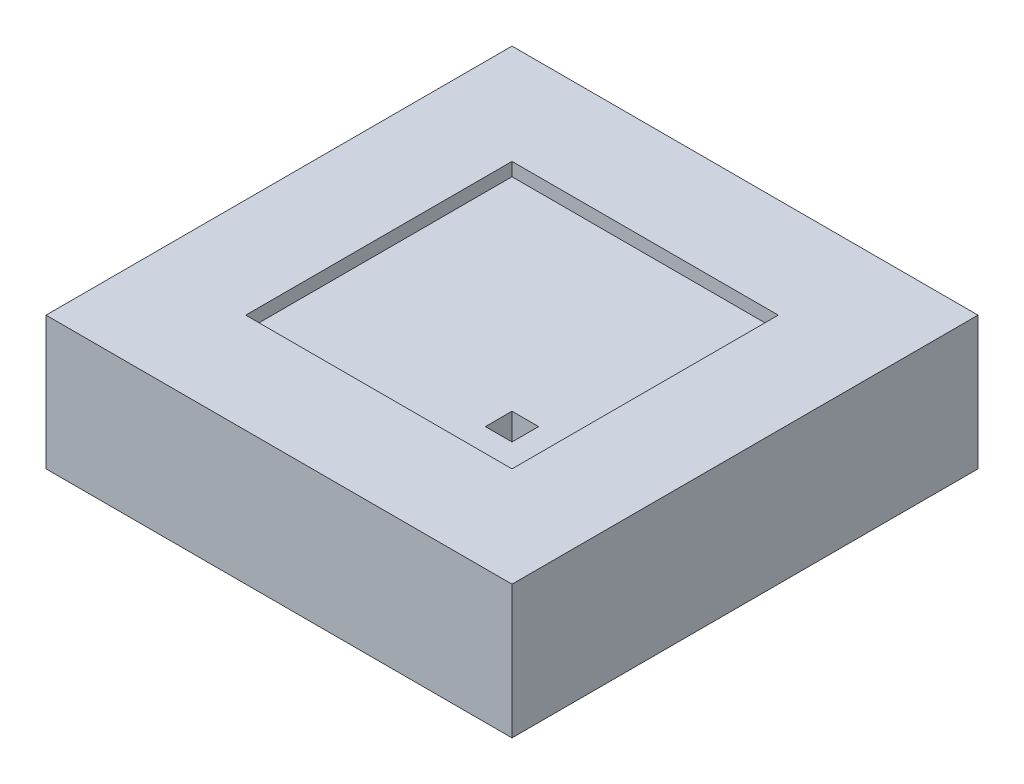
ISO-10303-21;
HEADER;
FILE_DESCRIPTION(('STEP AP214'),'2;1');
FILE_NAME('part.step','',(''),(''),'','','');
FILE_SCHEMA(('AUTOMOTIVE_DESIGN { 1 0 10303 214 1 1 1 1 }'));
ENDSEC;
DATA;
#1=APPLICATION_CONTEXT('core data for automotive mechanical design processes');
#2=APPLICATION_PROTOCOL_DEFINITION('international standard','automotive_design',2000,#1);
#3=PRODUCT_CONTEXT('',#1,'mechanical');
#4=PRODUCT('Part','Part','',(#3));
#5=PRODUCT_RELATED_PRODUCT_CATEGORY('part','',(#4));
#6=PRODUCT_DEFINITION_FORMATION('','',#4);
#7=PRODUCT_DEFINITION_CONTEXT('part definition',#1,'design');
#8=PRODUCT_DEFINITION('design','',#6,#7);
#9=PRODUCT_DEFINITION_SHAPE('','',#8);
#10=(LENGTH_UNIT() NAMED_UNIT(*) SI_UNIT(.MILLI.,.METRE.));
#11=(NAMED_UNIT(*) PLANE_ANGLE_UNIT() SI_UNIT($,.RADIAN.));
#12=(NAMED_UNIT(*) SI_UNIT($,.STERADIAN.) SOLID_ANGLE_UNIT());
#13=UNCERTAINTY_MEASURE_WITH_UNIT(LENGTH_MEASURE(1.E-05),#10,'distance_accuracy_value','');
#14=(GEOMETRIC_REPRESENTATION_CONTEXT(3) GLOBAL_UNCERTAINTY_ASSIGNED_CONTEXT((#13)) GLOBAL_UNIT_ASSIGNED_CONTEXT((#10,
#11,#12)) REPRESENTATION_CONTEXT('',''));
#15=CARTESIAN_POINT('',(0.,0.,0.));
#16=DIRECTION('',(0.,0.,1.));
#17=DIRECTION('',(1.,0.,0.));
#18=AXIS2_PLACEMENT_3D('',#15,#16,#17);
#19=CARTESIAN_POINT('',(0.,20.,0.));
#20=DIRECTION('',(1.,0.,0.));
#21=DIRECTION('',(0.,0.,-1.));
#22=AXIS2_PLACEMENT_3D('',#19,#20,#21);
#23=PLANE('',#22);
#24=DIRECTION('',(0.,0.,1.));
#25=VECTOR('',#24,1.);
#26=CARTESIAN_POINT('',(0.,0.,0.));
#27=LINE('',#26,#25);
#28=CARTESIAN_POINT('',(0.,0.,-70.));
#29=VERTEX_POINT('',#28);
#30=CARTESIAN_POINT('',(0.,0.,0.));
#31=VERTEX_POINT('',#30);
#32=EDGE_CURVE('E195',#29,#31,#27,.T.);
#33=ORIENTED_EDGE('',*,*,#32,.T.);
#34=DIRECTION('',(0.,-1.,0.));
#35=VECTOR('',#34,1.);
#36=CARTESIAN_POINT('',(0.,20.,0.));
#37=LINE('',#36,#35);
#38=CARTESIAN_POINT('',(0.,20.,0.));
#39=VERTEX_POINT('',#38);
#40=EDGE_CURVE('E12',#39,#31,#37,.T.);
#41=ORIENTED_EDGE('',*,*,#40,.F.);
#42=DIRECTION('',(0.,0.,1.));
#43=VECTOR('',#42,1.);
#44=CARTESIAN_POINT('',(0.,20.,0.));
#45=LINE('',#44,#43);
#46=CARTESIAN_POINT('',(0.,20.,-70.));
#47=VERTEX_POINT('',#46);
#48=EDGE_CURVE('E202',#47,#39,#45,.T.);
#49=ORIENTED_EDGE('',*,*,#48,.F.);
#50=DIRECTION('',(0.,-1.,0.));
#51=VECTOR('',#50,1.);
#52=CARTESIAN_POINT('',(0.,20.,-70.));
#53=LINE('',#52,#51);
#54=EDGE_CURVE('E219',#47,#29,#53,.T.);
#55=ORIENTED_EDGE('',*,*,#54,.T.);
#56=EDGE_LOOP('',(#33,#41,#49,#55));
#57=FACE_BOUND('',#56,.T.);
#58=ADVANCED_FACE('F37',(#57),#23,.F.);
#59=CARTESIAN_POINT('',(0.,20.,0.));
#60=DIRECTION('',(0.,0.,-1.));
#61=DIRECTION('',(-1.,0.,0.));
#62=AXIS2_PLACEMENT_3D('',#59,#60,#61);
#63=PLANE('',#62);
#64=DIRECTION('',(1.,0.,0.));
#65=VECTOR('',#64,1.);
#66=CARTESIAN_POINT('',(0.,0.,0.));
#67=LINE('',#66,#65);
#68=CARTESIAN_POINT('',(70.,0.,0.));
#69=VERTEX_POINT('',#68);
#70=EDGE_CURVE('E222',#31,#69,#67,.T.);
#71=ORIENTED_EDGE('',*,*,#70,.T.);
#72=DIRECTION('',(0.,-1.,0.));
#73=VECTOR('',#72,1.);
#74=CARTESIAN_POINT('',(70.,20.,0.));
#75=LINE('',#74,#73);
#76=CARTESIAN_POINT('',(70.,20.,0.));
#77=VERTEX_POINT('',#76);
#78=EDGE_CURVE('E44',#77,#69,#75,.T.);
#79=ORIENTED_EDGE('',*,*,#78,.F.);
#80=DIRECTION('',(1.,0.,0.));
#81=VECTOR('',#80,1.);
#82=CARTESIAN_POINT('',(0.,20.,0.));
#83=LINE('',#82,#81);
#84=EDGE_CURVE('E207',#39,#77,#83,.T.);
#85=ORIENTED_EDGE('',*,*,#84,.F.);
#86=ORIENTED_EDGE('',*,*,#40,.T.);
#87=EDGE_LOOP('',(#71,#79,#85,#86));
#88=FACE_BOUND('',#87,.T.);
#89=ADVANCED_FACE('F284',(#88),#63,.F.);
#90=CARTESIAN_POINT('',(70.,20.,0.));
#91=DIRECTION('',(-1.,0.,0.));
#92=DIRECTION('',(0.,0.,1.));
#93=AXIS2_PLACEMENT_3D('',#90,#91,#92);
#94=PLANE('',#93);
#95=DIRECTION('',(0.,0.,-1.));
#96=VECTOR('',#95,1.);
#97=CARTESIAN_POINT('',(70.,0.,0.));
#98=LINE('',#97,#96);
#99=CARTESIAN_POINT('',(70.,0.,-70.));
#100=VERTEX_POINT('',#99);
#101=EDGE_CURVE('E224',#69,#100,#98,.T.);
#102=ORIENTED_EDGE('',*,*,#101,.T.);
#103=DIRECTION('',(0.,-1.,0.));
#104=VECTOR('',#103,1.);
#105=CARTESIAN_POINT('',(70.,20.,-70.));
#106=LINE('',#105,#104);
#107=CARTESIAN_POINT('',(70.,20.,-70.));
#108=VERTEX_POINT('',#107);
#109=EDGE_CURVE('E229',#108,#100,#106,.T.);
#110=ORIENTED_EDGE('',*,*,#109,.F.);
#111=DIRECTION('',(0.,0.,-1.));
#112=VECTOR('',#111,1.);
#113=CARTESIAN_POINT('',(70.,20.,0.));
#114=LINE('',#113,#112);
#115=EDGE_CURVE('E212',#77,#108,#114,.T.);
#116=ORIENTED_EDGE('',*,*,#115,.F.);
#117=ORIENTED_EDGE('',*,*,#78,.T.);
#118=EDGE_LOOP('',(#102,#110,#116,#117));
#119=FACE_BOUND('',#118,.T.);
#120=ADVANCED_FACE('F236',(#119),#94,.F.);
#121=CARTESIAN_POINT('',(0.,20.,-70.));
#122=DIRECTION('',(0.,0.,1.));
#123=DIRECTION('',(1.,0.,0.));
#124=AXIS2_PLACEMENT_3D('',#121,#122,#123);
#125=PLANE('',#124);
#126=DIRECTION('',(-1.,0.,0.));
#127=VECTOR('',#126,1.);
#128=CARTESIAN_POINT('',(0.,0.,-70.));
#129=LINE('',#128,#127);
#130=EDGE_CURVE('E208',#100,#29,#129,.T.);
#131=ORIENTED_EDGE('',*,*,#130,.T.);
#132=ORIENTED_EDGE('',*,*,#54,.F.);
#133=DIRECTION('',(-1.,0.,0.));
#134=VECTOR('',#133,1.);
#135=CARTESIAN_POINT('',(0.,20.,-70.));
#136=LINE('',#135,#134);
#137=EDGE_CURVE('E215',#108,#47,#136,.T.);
#138=ORIENTED_EDGE('',*,*,#137,.F.);
#139=ORIENTED_EDGE('',*,*,#109,.T.);
#140=EDGE_LOOP('',(#131,#132,#138,#139));
#141=FACE_BOUND('',#140,.T.);
#142=ADVANCED_FACE('F245',(#141),#125,.F.);
#143=CARTESIAN_POINT('',(0.,20.,0.));
#144=DIRECTION('',(0.,-1.,0.));
#145=DIRECTION('',(0.,0.,-1.));
#146=AXIS2_PLACEMENT_3D('',#143,#144,#145);
#147=PLANE('',#146);
#148=DIRECTION('',(0.,0.,1.));
#149=VECTOR('',#148,1.);
#150=CARTESIAN_POINT('',(15.,20.,-55.));
#151=LINE('',#150,#149);
#152=CARTESIAN_POINT('',(15.,20.,-55.));
#153=VERTEX_POINT('',#152);
#154=CARTESIAN_POINT('',(15.,20.,-15.));
#155=VERTEX_POINT('',#154);
#156=EDGE_CURVE('E178',#153,#155,#151,.T.);
#157=ORIENTED_EDGE('',*,*,#156,.F.);
#158=DIRECTION('',(-1.,0.,0.));
#159=VECTOR('',#158,1.);
#160=CARTESIAN_POINT('',(55.,20.,-55.));
#161=LINE('',#160,#159);
#162=CARTESIAN_POINT('',(55.,20.,-55.));
#163=VERTEX_POINT('',#162);
#164=EDGE_CURVE('E160',#163,#153,#161,.T.);
#165=ORIENTED_EDGE('',*,*,#164,.F.);
#166=DIRECTION('',(0.,0.,-1.));
#167=VECTOR('',#166,1.);
#168=CARTESIAN_POINT('',(55.,20.,-15.));
#169=LINE('',#168,#167);
#170=CARTESIAN_POINT('',(55.,20.,-15.));
#171=VERTEX_POINT('',#170);
#172=EDGE_CURVE('E165',#171,#163,#169,.T.);
#173=ORIENTED_EDGE('',*,*,#172,.F.);
#174=DIRECTION('',(1.,0.,0.));
#175=VECTOR('',#174,1.);
#176=CARTESIAN_POINT('',(15.,20.,-15.));
#177=LINE('',#176,#175);
#178=EDGE_CURVE('E191',#155,#171,#177,.T.);
#179=ORIENTED_EDGE('',*,*,#178,.F.);
#180=EDGE_LOOP('',(#157,#165,#173,#179));
#181=FACE_BOUND('',#180,.T.);
#182=ORIENTED_EDGE('',*,*,#48,.T.);
#183=ORIENTED_EDGE('',*,*,#84,.T.);
#184=ORIENTED_EDGE('',*,*,#115,.T.);
#185=ORIENTED_EDGE('',*,*,#137,.T.);
#186=EDGE_LOOP('',(#182,#183,#184,#185));
#187=FACE_BOUND('',#186,.T.);
#188=ADVANCED_FACE('F251',(#181,#187),#147,.F.);
#189=CARTESIAN_POINT('',(0.,0.,0.));
#190=DIRECTION('',(0.,-1.,0.));
#191=DIRECTION('',(0.,0.,-1.));
#192=AXIS2_PLACEMENT_3D('',#189,#190,#191);
#193=PLANE('',#192);
#194=DIRECTION('',(0.,0.,-1.));
#195=VECTOR('',#194,1.);
#196=CARTESIAN_POINT('',(45.5,0.,0.));
#197=LINE('',#196,#195);
#198=CARTESIAN_POINT('',(45.5,0.,-20.5));
#199=VERTEX_POINT('',#198);
#200=CARTESIAN_POINT('',(45.5,0.,-24.5));
#201=VERTEX_POINT('',#200);
#202=EDGE_CURVE('E158',#199,#201,#197,.T.);
#203=ORIENTED_EDGE('',*,*,#202,.F.);
#204=DIRECTION('',(-1.,0.,0.));
#205=VECTOR('',#204,1.);
#206=CARTESIAN_POINT('',(0.,0.,-20.5));
#207=LINE('',#206,#205);
#208=CARTESIAN_POINT('',(49.5,0.,-20.5));
#209=VERTEX_POINT('',#208);
#210=EDGE_CURVE('E151',#209,#199,#207,.T.);
#211=ORIENTED_EDGE('',*,*,#210,.F.);
#212=DIRECTION('',(0.,0.,1.));
#213=VECTOR('',#212,1.);
#214=CARTESIAN_POINT('',(49.5,0.,0.));
#215=LINE('',#214,#213);
#216=CARTESIAN_POINT('',(49.5,0.,-24.5));
#217=VERTEX_POINT('',#216);
#218=EDGE_CURVE('E131',#217,#209,#215,.T.);
#219=ORIENTED_EDGE('',*,*,#218,.F.);
#220=DIRECTION('',(1.,0.,0.));
#221=VECTOR('',#220,1.);
#222=CARTESIAN_POINT('',(0.,0.,-24.5));
#223=LINE('',#222,#221);
#224=EDGE_CURVE('E156',#201,#217,#223,.T.);
#225=ORIENTED_EDGE('',*,*,#224,.F.);
#226=EDGE_LOOP('',(#203,#211,#219,#225));
#227=FACE_BOUND('',#226,.T.);
#228=ORIENTED_EDGE('',*,*,#32,.F.);
#229=ORIENTED_EDGE('',*,*,#130,.F.);
#230=ORIENTED_EDGE('',*,*,#101,.F.);
#231=ORIENTED_EDGE('',*,*,#70,.F.);
#232=EDGE_LOOP('',(#228,#229,#230,#231));
#233=FACE_BOUND('',#232,.T.);
#234=ADVANCED_FACE('F242',(#227,#233),#193,.T.);
#235=CARTESIAN_POINT('',(55.,18.,-55.));
#236=DIRECTION('',(0.,0.,-1.));
#237=DIRECTION('',(-1.,0.,0.));
#238=AXIS2_PLACEMENT_3D('',#235,#236,#237);
#239=PLANE('',#238);
#240=ORIENTED_EDGE('',*,*,#164,.T.);
#241=DIRECTION('',(0.,1.,0.));
#242=VECTOR('',#241,1.);
#243=CARTESIAN_POINT('',(15.,18.,-55.));
#244=LINE('',#243,#242);
#245=CARTESIAN_POINT('',(15.,18.,-55.));
#246=VERTEX_POINT('',#245);
#247=EDGE_CURVE('E174',#246,#153,#244,.T.);
#248=ORIENTED_EDGE('',*,*,#247,.F.);
#249=DIRECTION('',(-1.,0.,0.));
#250=VECTOR('',#249,1.);
#251=CARTESIAN_POINT('',(55.,18.,-55.));
#252=LINE('',#251,#250);
#253=CARTESIAN_POINT('',(55.,18.,-55.));
#254=VERTEX_POINT('',#253);
#255=EDGE_CURVE('E161',#254,#246,#252,.T.);
#256=ORIENTED_EDGE('',*,*,#255,.F.);
#257=DIRECTION('',(0.,1.,0.));
#258=VECTOR('',#257,1.);
#259=CARTESIAN_POINT('',(55.,18.,-55.));
#260=LINE('',#259,#258);
#261=EDGE_CURVE('E193',#254,#163,#260,.T.);
#262=ORIENTED_EDGE('',*,*,#261,.T.);
#263=EDGE_LOOP('',(#240,#248,#256,#262));
#264=FACE_BOUND('',#263,.T.);
#265=ADVANCED_FACE('F271',(#264),#239,.F.);
#266=CARTESIAN_POINT('',(55.,18.,-15.));
#267=DIRECTION('',(1.,0.,0.));
#268=DIRECTION('',(0.,0.,-1.));
#269=AXIS2_PLACEMENT_3D('',#266,#267,#268);
#270=PLANE('',#269);
#271=ORIENTED_EDGE('',*,*,#172,.T.);
#272=ORIENTED_EDGE('',*,*,#261,.F.);
#273=DIRECTION('',(0.,0.,-1.));
#274=VECTOR('',#273,1.);
#275=CARTESIAN_POINT('',(55.,18.,-15.));
#276=LINE('',#275,#274);
#277=CARTESIAN_POINT('',(55.,18.,-15.));
#278=VERTEX_POINT('',#277);
#279=EDGE_CURVE('E171',#278,#254,#276,.T.);
#280=ORIENTED_EDGE('',*,*,#279,.F.);
#281=DIRECTION('',(0.,1.,0.));
#282=VECTOR('',#281,1.);
#283=CARTESIAN_POINT('',(55.,18.,-15.));
#284=LINE('',#283,#282);
#285=EDGE_CURVE('E196',#278,#171,#284,.T.);
#286=ORIENTED_EDGE('',*,*,#285,.T.);
#287=EDGE_LOOP('',(#271,#272,#280,#286));
#288=FACE_BOUND('',#287,.T.);
#289=ADVANCED_FACE('F273',(#288),#270,.F.);
#290=CARTESIAN_POINT('',(15.,18.,-15.));
#291=DIRECTION('',(0.,0.,1.));
#292=DIRECTION('',(1.,0.,0.));
#293=AXIS2_PLACEMENT_3D('',#290,#291,#292);
#294=PLANE('',#293);
#295=ORIENTED_EDGE('',*,*,#178,.T.);
#296=ORIENTED_EDGE('',*,*,#285,.F.);
#297=DIRECTION('',(1.,0.,0.));
#298=VECTOR('',#297,1.);
#299=CARTESIAN_POINT('',(15.,18.,-15.));
#300=LINE('',#299,#298);
#301=CARTESIAN_POINT('',(15.,18.,-15.));
#302=VERTEX_POINT('',#301);
#303=EDGE_CURVE('E168',#302,#278,#300,.T.);
#304=ORIENTED_EDGE('',*,*,#303,.F.);
#305=DIRECTION('',(0.,1.,0.));
#306=VECTOR('',#305,1.);
#307=CARTESIAN_POINT('',(15.,18.,-15.));
#308=LINE('',#307,#306);
#309=EDGE_CURVE('E198',#302,#155,#308,.T.);
#310=ORIENTED_EDGE('',*,*,#309,.T.);
#311=EDGE_LOOP('',(#295,#296,#304,#310));
#312=FACE_BOUND('',#311,.T.);
#313=ADVANCED_FACE('F267',(#312),#294,.F.);
#314=CARTESIAN_POINT('',(15.,18.,-55.));
#315=DIRECTION('',(-1.,0.,0.));
#316=DIRECTION('',(0.,0.,1.));
#317=AXIS2_PLACEMENT_3D('',#314,#315,#316);
#318=PLANE('',#317);
#319=ORIENTED_EDGE('',*,*,#156,.T.);
#320=ORIENTED_EDGE('',*,*,#309,.F.);
#321=DIRECTION('',(0.,0.,1.));
#322=VECTOR('',#321,1.);
#323=CARTESIAN_POINT('',(15.,18.,-55.));
#324=LINE('',#323,#322);
#325=EDGE_CURVE('E164',#246,#302,#324,.T.);
#326=ORIENTED_EDGE('',*,*,#325,.F.);
#327=ORIENTED_EDGE('',*,*,#247,.T.);
#328=EDGE_LOOP('',(#319,#320,#326,#327));
#329=FACE_BOUND('',#328,.T.);
#330=ADVANCED_FACE('F260',(#329),#318,.F.);
#331=CARTESIAN_POINT('',(0.,18.,0.));
#332=DIRECTION('',(0.,1.,0.));
#333=DIRECTION('',(0.,0.,1.));
#334=AXIS2_PLACEMENT_3D('',#331,#332,#333);
#335=PLANE('',#334);
#336=DIRECTION('',(0.,0.,1.));
#337=VECTOR('',#336,1.);
#338=CARTESIAN_POINT('',(45.5,18.,-20.5));
#339=LINE('',#338,#337);
#340=CARTESIAN_POINT('',(45.5,18.,-24.5));
#341=VERTEX_POINT('',#340);
#342=CARTESIAN_POINT('',(45.5,18.,-20.5));
#343=VERTEX_POINT('',#342);
#344=EDGE_CURVE('E59',#341,#343,#339,.T.);
#345=ORIENTED_EDGE('',*,*,#344,.F.);
#346=DIRECTION('',(-1.,0.,0.));
#347=VECTOR('',#346,1.);
#348=CARTESIAN_POINT('',(45.5,18.,-24.5));
#349=LINE('',#348,#347);
#350=CARTESIAN_POINT('',(49.5,18.,-24.5));
#351=VERTEX_POINT('',#350);
#352=EDGE_CURVE('E144',#351,#341,#349,.T.);
#353=ORIENTED_EDGE('',*,*,#352,.F.);
#354=DIRECTION('',(0.,0.,-1.));
#355=VECTOR('',#354,1.);
#356=CARTESIAN_POINT('',(49.5,18.,-20.5));
#357=LINE('',#356,#355);
#358=CARTESIAN_POINT('',(49.5,18.,-20.5));
#359=VERTEX_POINT('',#358);
#360=EDGE_CURVE('E128',#359,#351,#357,.T.);
#361=ORIENTED_EDGE('',*,*,#360,.F.);
#362=DIRECTION('',(1.,0.,0.));
#363=VECTOR('',#362,1.);
#364=CARTESIAN_POINT('',(45.5,18.,-20.5));
#365=LINE('',#364,#363);
#366=EDGE_CURVE('E137',#343,#359,#365,.T.);
#367=ORIENTED_EDGE('',*,*,#366,.F.);
#368=EDGE_LOOP('',(#345,#353,#361,#367));
#369=FACE_BOUND('',#368,.T.);
#370=ORIENTED_EDGE('',*,*,#255,.T.);
#371=ORIENTED_EDGE('',*,*,#325,.T.);
#372=ORIENTED_EDGE('',*,*,#303,.T.);
#373=ORIENTED_EDGE('',*,*,#279,.T.);
#374=EDGE_LOOP('',(#370,#371,#372,#373));
#375=FACE_BOUND('',#374,.T.);
#376=ADVANCED_FACE('F141',(#369,#375),#335,.T.);
#377=CARTESIAN_POINT('',(45.5,-37.,-20.5));
#378=DIRECTION('',(-1.,0.,0.));
#379=DIRECTION('',(0.,0.,1.));
#380=AXIS2_PLACEMENT_3D('',#377,#378,#379);
#381=PLANE('',#380);
#382=ORIENTED_EDGE('',*,*,#202,.T.);
#383=DIRECTION('',(0.,1.,0.));
#384=VECTOR('',#383,1.);
#385=CARTESIAN_POINT('',(45.5,-37.,-24.5));
#386=LINE('',#385,#384);
#387=EDGE_CURVE('E149',#201,#341,#386,.T.);
#388=ORIENTED_EDGE('',*,*,#387,.T.);
#389=ORIENTED_EDGE('',*,*,#344,.T.);
#390=DIRECTION('',(0.,1.,0.));
#391=VECTOR('',#390,1.);
#392=CARTESIAN_POINT('',(45.5,-37.,-20.5));
#393=LINE('',#392,#391);
#394=EDGE_CURVE('E134',#199,#343,#393,.T.);
#395=ORIENTED_EDGE('',*,*,#394,.F.);
#396=EDGE_LOOP('',(#382,#388,#389,#395));
#397=FACE_BOUND('',#396,.T.);
#398=ADVANCED_FACE('F304',(#397),#381,.F.);
#399=CARTESIAN_POINT('',(45.5,-37.,-24.5));
#400=DIRECTION('',(0.,0.,-1.));
#401=DIRECTION('',(-1.,0.,0.));
#402=AXIS2_PLACEMENT_3D('',#399,#400,#401);
#403=PLANE('',#402);
#404=ORIENTED_EDGE('',*,*,#224,.T.);
#405=DIRECTION('',(0.,1.,0.));
#406=VECTOR('',#405,1.);
#407=CARTESIAN_POINT('',(49.5,-37.,-24.5));
#408=LINE('',#407,#406);
#409=EDGE_CURVE('E133',#217,#351,#408,.T.);
#410=ORIENTED_EDGE('',*,*,#409,.T.);
#411=ORIENTED_EDGE('',*,*,#352,.T.);
#412=ORIENTED_EDGE('',*,*,#387,.F.);
#413=EDGE_LOOP('',(#404,#410,#411,#412));
#414=FACE_BOUND('',#413,.T.);
#415=ADVANCED_FACE('F308',(#414),#403,.F.);
#416=CARTESIAN_POINT('',(49.5,-37.,-20.5));
#417=DIRECTION('',(1.,0.,0.));
#418=DIRECTION('',(0.,0.,-1.));
#419=AXIS2_PLACEMENT_3D('',#416,#417,#418);
#420=PLANE('',#419);
#421=ORIENTED_EDGE('',*,*,#218,.T.);
#422=DIRECTION('',(0.,1.,0.));
#423=VECTOR('',#422,1.);
#424=CARTESIAN_POINT('',(49.5,-37.,-20.5));
#425=LINE('',#424,#423);
#426=EDGE_CURVE('E51',#209,#359,#425,.T.);
#427=ORIENTED_EDGE('',*,*,#426,.T.);
#428=ORIENTED_EDGE('',*,*,#360,.T.);
#429=ORIENTED_EDGE('',*,*,#409,.F.);
#430=EDGE_LOOP('',(#421,#427,#428,#429));
#431=FACE_BOUND('',#430,.T.);
#432=ADVANCED_FACE('F125',(#431),#420,.F.);
#433=CARTESIAN_POINT('',(45.5,-37.,-20.5));
#434=DIRECTION('',(0.,0.,1.));
#435=DIRECTION('',(1.,0.,0.));
#436=AXIS2_PLACEMENT_3D('',#433,#434,#435);
#437=PLANE('',#436);
#438=ORIENTED_EDGE('',*,*,#210,.T.);
#439=ORIENTED_EDGE('',*,*,#394,.T.);
#440=ORIENTED_EDGE('',*,*,#366,.T.);
#441=ORIENTED_EDGE('',*,*,#426,.F.);
#442=EDGE_LOOP('',(#438,#439,#440,#441));
#443=FACE_BOUND('',#442,.T.);
#444=ADVANCED_FACE('F138',(#443),#437,.F.);
#445=CLOSED_SHELL('',(#58,#89,#120,#142,#188,#234,#265,#289,#313,#330,#376,#398,#415,#432,#444));
#446=MANIFOLD_SOLID_BREP('B2',#445);
#447=ADVANCED_BREP_SHAPE_REPRESENTATION('',(#18,#446),#14);
#448=SHAPE_DEFINITION_REPRESENTATION(#9,#447);
ENDSEC;
END-ISO-10303-21;
